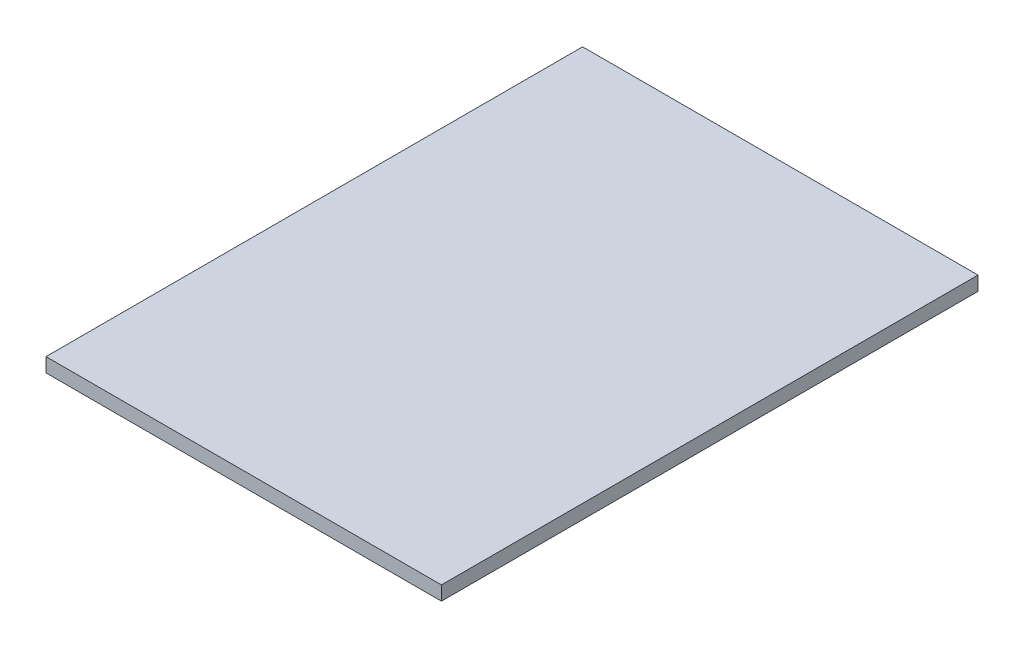
ISO-10303-21;
HEADER;
FILE_DESCRIPTION(('STEP AP214'),'2;1');
FILE_NAME('part.step','',(''),(''),'','','');
FILE_SCHEMA(('AUTOMOTIVE_DESIGN { 1 0 10303 214 1 1 1 1 }'));
ENDSEC;
DATA;
#1=APPLICATION_CONTEXT('core data for automotive mechanical design processes');
#2=APPLICATION_PROTOCOL_DEFINITION('international standard','automotive_design',2000,#1);
#3=PRODUCT_CONTEXT('',#1,'mechanical');
#4=PRODUCT('Part','Part','',(#3));
#5=PRODUCT_RELATED_PRODUCT_CATEGORY('part','',(#4));
#6=PRODUCT_DEFINITION_FORMATION('','',#4);
#7=PRODUCT_DEFINITION_CONTEXT('part definition',#1,'design');
#8=PRODUCT_DEFINITION('design','',#6,#7);
#9=PRODUCT_DEFINITION_SHAPE('','',#8);
#10=(LENGTH_UNIT() NAMED_UNIT(*) SI_UNIT(.MILLI.,.METRE.));
#11=(NAMED_UNIT(*) PLANE_ANGLE_UNIT() SI_UNIT($,.RADIAN.));
#12=(NAMED_UNIT(*) SI_UNIT($,.STERADIAN.) SOLID_ANGLE_UNIT());
#13=UNCERTAINTY_MEASURE_WITH_UNIT(LENGTH_MEASURE(1.E-05),#10,'distance_accuracy_value','');
#14=(GEOMETRIC_REPRESENTATION_CONTEXT(3) GLOBAL_UNCERTAINTY_ASSIGNED_CONTEXT((#13)) GLOBAL_UNIT_ASSIGNED_CONTEXT((#10,
#11,#12)) REPRESENTATION_CONTEXT('',''));
#15=CARTESIAN_POINT('',(0.,0.,0.));
#16=DIRECTION('',(0.,0.,1.));
#17=DIRECTION('',(1.,0.,0.));
#18=AXIS2_PLACEMENT_3D('',#15,#16,#17);
#19=CARTESIAN_POINT('',(0.,3.175,0.));
#20=DIRECTION('',(0.,1.,0.));
#21=DIRECTION('',(0.,0.,1.));
#22=AXIS2_PLACEMENT_3D('',#19,#20,#21);
#23=PLANE('',#22);
#24=DIRECTION('',(1.,0.,0.));
#25=VECTOR('',#24,1.);
#26=CARTESIAN_POINT('',(-88.9,3.175,120.65));
#27=LINE('',#26,#25);
#28=CARTESIAN_POINT('',(88.9,3.175,120.65));
#29=VERTEX_POINT('',#28);
#30=CARTESIAN_POINT('',(-88.9,3.175,120.65));
#31=VERTEX_POINT('',#30);
#32=EDGE_CURVE('E68',#29,#31,#27,.F.);
#33=ORIENTED_EDGE('',*,*,#32,.F.);
#34=DIRECTION('',(0.,0.,-1.));
#35=VECTOR('',#34,1.);
#36=CARTESIAN_POINT('',(88.9,3.175,120.65));
#37=LINE('',#36,#35);
#38=CARTESIAN_POINT('',(88.9,3.175,-120.65));
#39=VERTEX_POINT('',#38);
#40=EDGE_CURVE('E20',#39,#29,#37,.F.);
#41=ORIENTED_EDGE('',*,*,#40,.F.);
#42=DIRECTION('',(-1.,0.,0.));
#43=VECTOR('',#42,1.);
#44=CARTESIAN_POINT('',(88.9,3.175,-120.65));
#45=LINE('',#44,#43);
#46=CARTESIAN_POINT('',(-88.9,3.175,-120.65));
#47=VERTEX_POINT('',#46);
#48=EDGE_CURVE('E58',#47,#39,#45,.F.);
#49=ORIENTED_EDGE('',*,*,#48,.F.);
#50=DIRECTION('',(0.,0.,1.));
#51=VECTOR('',#50,1.);
#52=CARTESIAN_POINT('',(-88.9,3.175,-120.65));
#53=LINE('',#52,#51);
#54=EDGE_CURVE('E53',#31,#47,#53,.F.);
#55=ORIENTED_EDGE('',*,*,#54,.F.);
#56=EDGE_LOOP('',(#33,#41,#49,#55));
#57=FACE_BOUND('',#56,.T.);
#58=ADVANCED_FACE('F17',(#57),#23,.T.);
#59=CARTESIAN_POINT('',(88.9,-3.175,120.65));
#60=DIRECTION('',(1.,0.,0.));
#61=DIRECTION('',(0.,0.,-1.));
#62=AXIS2_PLACEMENT_3D('',#59,#60,#61);
#63=PLANE('',#62);
#64=DIRECTION('',(0.,1.,0.));
#65=VECTOR('',#64,1.);
#66=CARTESIAN_POINT('',(88.9,-3.175,120.65));
#67=LINE('',#66,#65);
#68=CARTESIAN_POINT('',(88.9,-3.175,120.65));
#69=VERTEX_POINT('',#68);
#70=EDGE_CURVE('E79',#69,#29,#67,.T.);
#71=ORIENTED_EDGE('',*,*,#70,.F.);
#72=DIRECTION('',(0.,0.,1.));
#73=VECTOR('',#72,1.);
#74=CARTESIAN_POINT('',(88.9,-3.175,0.));
#75=LINE('',#74,#73);
#76=CARTESIAN_POINT('',(88.9,-3.175,-120.65));
#77=VERTEX_POINT('',#76);
#78=EDGE_CURVE('E74',#69,#77,#75,.F.);
#79=ORIENTED_EDGE('',*,*,#78,.T.);
#80=DIRECTION('',(0.,1.,0.));
#81=VECTOR('',#80,1.);
#82=CARTESIAN_POINT('',(88.9,-3.175,-120.65));
#83=LINE('',#82,#81);
#84=EDGE_CURVE('E63',#39,#77,#83,.F.);
#85=ORIENTED_EDGE('',*,*,#84,.F.);
#86=ORIENTED_EDGE('',*,*,#40,.T.);
#87=EDGE_LOOP('',(#71,#79,#85,#86));
#88=FACE_BOUND('',#87,.T.);
#89=ADVANCED_FACE('F73',(#88),#63,.T.);
#90=CARTESIAN_POINT('',(88.9,-3.175,-120.65));
#91=DIRECTION('',(0.,0.,-1.));
#92=DIRECTION('',(-1.,0.,0.));
#93=AXIS2_PLACEMENT_3D('',#90,#91,#92);
#94=PLANE('',#93);
#95=ORIENTED_EDGE('',*,*,#84,.T.);
#96=DIRECTION('',(1.,0.,0.));
#97=VECTOR('',#96,1.);
#98=CARTESIAN_POINT('',(0.,-3.175,-120.65));
#99=LINE('',#98,#97);
#100=CARTESIAN_POINT('',(-88.9,-3.175,-120.65));
#101=VERTEX_POINT('',#100);
#102=EDGE_CURVE('E84',#77,#101,#99,.F.);
#103=ORIENTED_EDGE('',*,*,#102,.T.);
#104=DIRECTION('',(0.,1.,0.));
#105=VECTOR('',#104,1.);
#106=CARTESIAN_POINT('',(-88.9,-3.175,-120.65));
#107=LINE('',#106,#105);
#108=EDGE_CURVE('E65',#47,#101,#107,.F.);
#109=ORIENTED_EDGE('',*,*,#108,.F.);
#110=ORIENTED_EDGE('',*,*,#48,.T.);
#111=EDGE_LOOP('',(#95,#103,#109,#110));
#112=FACE_BOUND('',#111,.T.);
#113=ADVANCED_FACE('F60',(#112),#94,.T.);
#114=CARTESIAN_POINT('',(-88.9,-3.175,-120.65));
#115=DIRECTION('',(-1.,0.,0.));
#116=DIRECTION('',(0.,0.,1.));
#117=AXIS2_PLACEMENT_3D('',#114,#115,#116);
#118=PLANE('',#117);
#119=ORIENTED_EDGE('',*,*,#108,.T.);
#120=DIRECTION('',(0.,0.,1.));
#121=VECTOR('',#120,1.);
#122=CARTESIAN_POINT('',(-88.9,-3.175,0.));
#123=LINE('',#122,#121);
#124=CARTESIAN_POINT('',(-88.9,-3.175,120.65));
#125=VERTEX_POINT('',#124);
#126=EDGE_CURVE('E26',#101,#125,#123,.T.);
#127=ORIENTED_EDGE('',*,*,#126,.T.);
#128=DIRECTION('',(0.,1.,0.));
#129=VECTOR('',#128,1.);
#130=CARTESIAN_POINT('',(-88.9,-3.175,120.65));
#131=LINE('',#130,#129);
#132=EDGE_CURVE('E34',#31,#125,#131,.F.);
#133=ORIENTED_EDGE('',*,*,#132,.F.);
#134=ORIENTED_EDGE('',*,*,#54,.T.);
#135=EDGE_LOOP('',(#119,#127,#133,#134));
#136=FACE_BOUND('',#135,.T.);
#137=ADVANCED_FACE('F88',(#136),#118,.T.);
#138=CARTESIAN_POINT('',(-88.9,-3.175,120.65));
#139=DIRECTION('',(0.,0.,1.));
#140=DIRECTION('',(1.,0.,0.));
#141=AXIS2_PLACEMENT_3D('',#138,#139,#140);
#142=PLANE('',#141);
#143=ORIENTED_EDGE('',*,*,#132,.T.);
#144=DIRECTION('',(1.,0.,0.));
#145=VECTOR('',#144,1.);
#146=CARTESIAN_POINT('',(0.,-3.175,120.65));
#147=LINE('',#146,#145);
#148=EDGE_CURVE('E11',#125,#69,#147,.T.);
#149=ORIENTED_EDGE('',*,*,#148,.T.);
#150=ORIENTED_EDGE('',*,*,#70,.T.);
#151=ORIENTED_EDGE('',*,*,#32,.T.);
#152=EDGE_LOOP('',(#143,#149,#150,#151));
#153=FACE_BOUND('',#152,.T.);
#154=ADVANCED_FACE('F91',(#153),#142,.T.);
#155=CARTESIAN_POINT('',(0.,-3.175,0.));
#156=DIRECTION('',(0.,1.,0.));
#157=DIRECTION('',(0.,0.,1.));
#158=AXIS2_PLACEMENT_3D('',#155,#156,#157);
#159=PLANE('',#158);
#160=ORIENTED_EDGE('',*,*,#126,.F.);
#161=ORIENTED_EDGE('',*,*,#102,.F.);
#162=ORIENTED_EDGE('',*,*,#78,.F.);
#163=ORIENTED_EDGE('',*,*,#148,.F.);
#164=EDGE_LOOP('',(#160,#161,#162,#163));
#165=FACE_BOUND('',#164,.T.);
#166=ADVANCED_FACE('F90',(#165),#159,.F.);
#167=CLOSED_SHELL('',(#58,#89,#113,#137,#154,#166));
#168=MANIFOLD_SOLID_BREP('B1',#167);
#169=ADVANCED_BREP_SHAPE_REPRESENTATION('',(#18,#168),#14);
#170=SHAPE_DEFINITION_REPRESENTATION(#9,#169);
ENDSEC;
END-ISO-10303-21;
